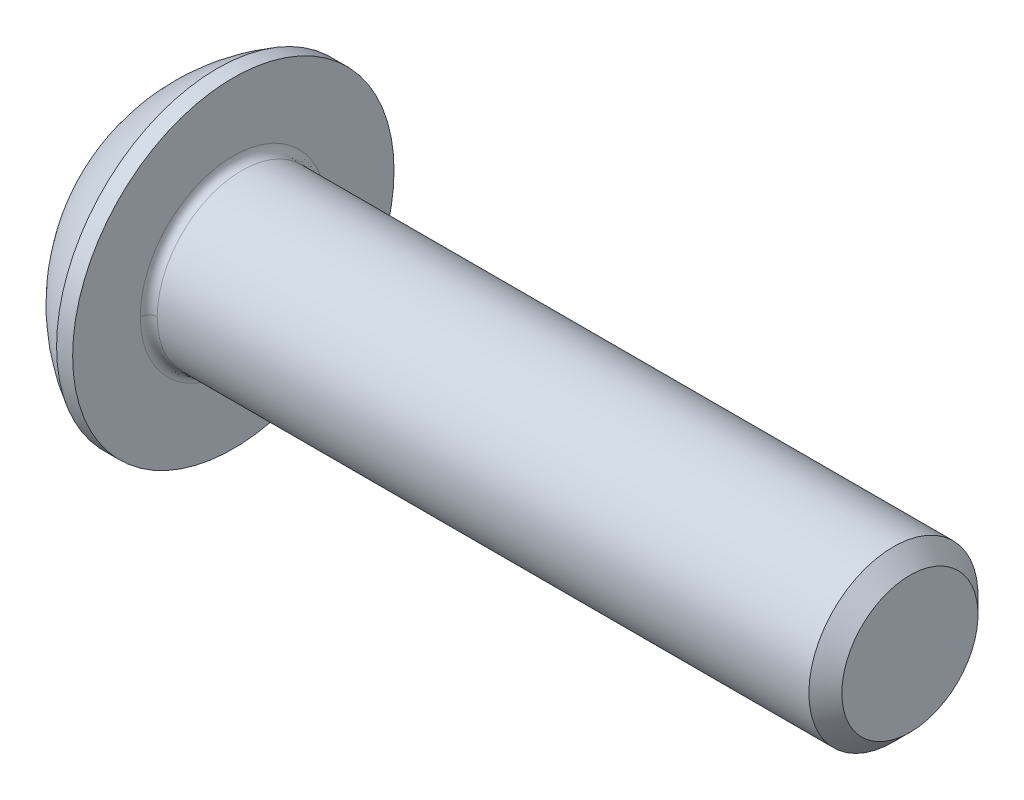
ISO-10303-21;
HEADER;
FILE_DESCRIPTION(('STEP AP214'),'2;1');
FILE_NAME('part.step','',(''),(''),'','','');
FILE_SCHEMA(('AUTOMOTIVE_DESIGN { 1 0 10303 214 1 1 1 1 }'));
ENDSEC;
DATA;
#1=APPLICATION_CONTEXT('core data for automotive mechanical design processes');
#2=APPLICATION_PROTOCOL_DEFINITION('international standard','automotive_design',2000,#1);
#3=PRODUCT_CONTEXT('',#1,'mechanical');
#4=PRODUCT('Part','Part','',(#3));
#5=PRODUCT_RELATED_PRODUCT_CATEGORY('part','',(#4));
#6=PRODUCT_DEFINITION_FORMATION('','',#4);
#7=PRODUCT_DEFINITION_CONTEXT('part definition',#1,'design');
#8=PRODUCT_DEFINITION('design','',#6,#7);
#9=PRODUCT_DEFINITION_SHAPE('','',#8);
#10=(LENGTH_UNIT() NAMED_UNIT(*) SI_UNIT(.MILLI.,.METRE.));
#11=(NAMED_UNIT(*) PLANE_ANGLE_UNIT() SI_UNIT($,.RADIAN.));
#12=(NAMED_UNIT(*) SI_UNIT($,.STERADIAN.) SOLID_ANGLE_UNIT());
#13=UNCERTAINTY_MEASURE_WITH_UNIT(LENGTH_MEASURE(1.E-05),#10,'distance_accuracy_value','');
#14=(GEOMETRIC_REPRESENTATION_CONTEXT(3) GLOBAL_UNCERTAINTY_ASSIGNED_CONTEXT((#13)) GLOBAL_UNIT_ASSIGNED_CONTEXT((#10,
#11,#12)) REPRESENTATION_CONTEXT('',''));
#15=CARTESIAN_POINT('',(0.,0.,0.));
#16=DIRECTION('',(0.,0.,1.));
#17=DIRECTION('',(1.,0.,0.));
#18=AXIS2_PLACEMENT_3D('',#15,#16,#17);
#19=CARTESIAN_POINT('',(18.2,-1.62932,-1.62932));
#20=DIRECTION('',(-1.,0.,0.));
#21=DIRECTION('',(0.,0.,1.));
#22=AXIS2_PLACEMENT_3D('',#19,#20,#21);
#23=PLANE('',#22);
#24=CARTESIAN_POINT('',(18.2,0.,0.));
#25=DIRECTION('',(-1.,0.,0.));
#26=DIRECTION('',(0.,0.,1.));
#27=AXIS2_PLACEMENT_3D('',#24,#25,#26);
#28=CIRCLE('',#27,1.61000000000001);
#29=CARTESIAN_POINT('',(18.2,0.,1.61000000000001));
#30=VERTEX_POINT('',#29);
#31=EDGE_CURVE('E20',#30,#30,#28,.F.);
#32=ORIENTED_EDGE('',*,*,#31,.T.);
#33=EDGE_LOOP('',(#32));
#34=FACE_BOUND('',#33,.T.);
#35=ADVANCED_FACE('F16',(#34),#23,.F.);
#36=CARTESIAN_POINT('',(18.2,0.,0.));
#37=DIRECTION('',(-1.,0.,0.));
#38=DIRECTION('',(0.,0.,1.));
#39=AXIS2_PLACEMENT_3D('',#36,#37,#38);
#40=CONICAL_SURFACE('',#39,1.61,0.785398163397451);
#41=CARTESIAN_POINT('',(17.81,0.,0.));
#42=DIRECTION('',(-1.,0.,0.));
#43=DIRECTION('',(0.,0.,1.));
#44=AXIS2_PLACEMENT_3D('',#41,#42,#43);
#45=CIRCLE('',#44,2.);
#46=CARTESIAN_POINT('',(17.81,0.,2.));
#47=VERTEX_POINT('',#46);
#48=EDGE_CURVE('E116',#47,#47,#45,.F.);
#49=ORIENTED_EDGE('',*,*,#48,.T.);
#50=EDGE_LOOP('',(#49));
#51=FACE_BOUND('',#50,.T.);
#52=ORIENTED_EDGE('',*,*,#31,.F.);
#53=EDGE_LOOP('',(#52));
#54=FACE_BOUND('',#53,.T.);
#55=ADVANCED_FACE('F250',(#51,#54),#40,.T.);
#56=CARTESIAN_POINT('',(17.81,0.,0.));
#57=DIRECTION('',(-1.,0.,0.));
#58=DIRECTION('',(0.,0.,1.));
#59=AXIS2_PLACEMENT_3D('',#56,#57,#58);
#60=CYLINDRICAL_SURFACE('',#59,2.);
#61=CARTESIAN_POINT('',(2.39999999962598,0.,0.));
#62=DIRECTION('',(1.,0.,0.));
#63=DIRECTION('',(0.,0.,-1.));
#64=AXIS2_PLACEMENT_3D('',#61,#62,#63);
#65=CIRCLE('',#64,1.99999999998839);
#66=CARTESIAN_POINT('',(2.39999999971949,-2.05103428515331E-10,-1.9999999999913));
#67=VERTEX_POINT('',#66);
#68=CARTESIAN_POINT('',(2.39999999971949,0.,1.9999999999913));
#69=VERTEX_POINT('',#68);
#70=EDGE_CURVE('E115',#67,#69,#65,.T.);
#71=ORIENTED_EDGE('',*,*,#70,.T.);
#72=CARTESIAN_POINT('',(2.39999999962598,0.,0.));
#73=DIRECTION('',(1.,0.,0.));
#74=DIRECTION('',(0.,0.,-1.));
#75=AXIS2_PLACEMENT_3D('',#72,#73,#74);
#76=CIRCLE('',#75,1.99999999998839);
#77=EDGE_CURVE('E106',#69,#67,#76,.T.);
#78=ORIENTED_EDGE('',*,*,#77,.T.);
#79=EDGE_LOOP('',(#71,#78));
#80=FACE_BOUND('',#79,.T.);
#81=ORIENTED_EDGE('',*,*,#48,.F.);
#82=EDGE_LOOP('',(#81));
#83=FACE_BOUND('',#82,.T.);
#84=ADVANCED_FACE('F124',(#80,#83),#60,.T.);
#85=CARTESIAN_POINT('',(2.419966683,0.,-2.000999167));
#86=CARTESIAN_POINT('',(2.419966683,-4.001998334,-2.000999167));
#87=CARTESIAN_POINT('',(2.419966683,-4.001998334,2.000999167));
#88=CARTESIAN_POINT('',(2.419966683,0.,2.000999167));
#89=CARTESIAN_POINT('',(2.283989247,0.,-1.987355915));
#90=CARTESIAN_POINT('',(2.283989247,-3.974711831,-1.987355915));
#91=CARTESIAN_POINT('',(2.283989247,-3.974711831,1.987355915));
#92=CARTESIAN_POINT('',(2.283989247,0.,1.987355915));
#93=CARTESIAN_POINT('',(2.187355915,0.,-2.083989247));
#94=CARTESIAN_POINT('',(2.187355915,-4.167978494,-2.083989247));
#95=CARTESIAN_POINT('',(2.187355915,-4.167978494,2.083989247));
#96=CARTESIAN_POINT('',(2.187355915,0.,2.083989247));
#97=CARTESIAN_POINT('',(2.200999167,0.,-2.219966683));
#98=CARTESIAN_POINT('',(2.200999167,-4.439933367,-2.219966683));
#99=CARTESIAN_POINT('',(2.200999167,-4.439933367,2.219966683));
#100=CARTESIAN_POINT('',(2.200999167,0.,2.219966683));
#101=(BOUNDED_SURFACE() B_SPLINE_SURFACE(3,3,((#85,#86,#87,#88),(#89,#90,#91,#92),(#93,#94,#95,
#96),(#97,#98,#99,#100)),.UNSPECIFIED.,.F.,.F.,.F.) B_SPLINE_SURFACE_WITH_KNOTS((4,4),(4,4),(0.,
1.),(0.,1.),.UNSPECIFIED.) GEOMETRIC_REPRESENTATION_ITEM() RATIONAL_B_SPLINE_SURFACE(((1.,
0.333333333333333,0.333333333333333,1.),(0.755320871117973,0.251773623705991,0.251773623705991,
0.755320871117973),(0.755320871117973,0.251773623705991,0.251773623705991,0.755320871117973),
(1.,0.333333333333333,0.333333333333333,1.))) REPRESENTATION_ITEM('') SURFACE());
#102=CARTESIAN_POINT('',(2.419966683,0.,-2.000999167));
#103=CARTESIAN_POINT('',(2.283989247,0.,-1.987355915));
#104=CARTESIAN_POINT('',(2.187355915,0.,-2.083989247));
#105=CARTESIAN_POINT('',(2.200999167,0.,-2.219966683));
#106=(BOUNDED_CURVE() B_SPLINE_CURVE(3,(#102,#103,#104,#105),.UNSPECIFIED.,.F.,
.F.) B_SPLINE_CURVE_WITH_KNOTS((4,4),(0.,1.),
.UNSPECIFIED.) CURVE() GEOMETRIC_REPRESENTATION_ITEM() RATIONAL_B_SPLINE_CURVE((1.,
0.755320871117973,0.755320871117973,1.)) REPRESENTATION_ITEM(''));
#107=CARTESIAN_POINT('',(2.19999999999304,0.,-2.19999999989933));
#108=VERTEX_POINT('',#107);
#109=EDGE_CURVE('E112',#108,#67,#106,.F.);
#110=CARTESIAN_POINT('',(2.419966683,0.,2.000999167));
#111=CARTESIAN_POINT('',(2.283989247,0.,1.987355915));
#112=CARTESIAN_POINT('',(2.187355915,0.,2.083989247));
#113=CARTESIAN_POINT('',(2.200999167,0.,2.219966683));
#114=(BOUNDED_CURVE() B_SPLINE_CURVE(3,(#110,#111,#112,#113),.UNSPECIFIED.,.F.,
.F.) B_SPLINE_CURVE_WITH_KNOTS((4,4),(0.,1.),
.UNSPECIFIED.) CURVE() GEOMETRIC_REPRESENTATION_ITEM() RATIONAL_B_SPLINE_CURVE((1.,
0.755320871117973,0.755320871117973,1.)) REPRESENTATION_ITEM(''));
#115=CARTESIAN_POINT('',(2.19999999999304,0.,2.19999999989934));
#116=VERTEX_POINT('',#115);
#117=EDGE_CURVE('E110',#69,#116,#114,.T.);
#118=CARTESIAN_POINT('',(2.19999999998839,0.,2.19999999940735));
#119=CARTESIAN_POINT('',(2.19999999998839,-4.39999999968315,2.19999999940735));
#120=CARTESIAN_POINT('',(2.19999999998839,-4.39999999968315,-2.19999999940735));
#121=CARTESIAN_POINT('',(2.19999999998839,0.,-2.19999999940735));
#122=(BOUNDED_CURVE() B_SPLINE_CURVE(3,(#118,#119,#120,#121),.UNSPECIFIED.,.F.,
.F.) B_SPLINE_CURVE_WITH_KNOTS((4,4),(0.,1.),
.UNSPECIFIED.) CURVE() GEOMETRIC_REPRESENTATION_ITEM() RATIONAL_B_SPLINE_CURVE((0.956578301732849,
0.31885943391095,0.31885943391095,0.956578301732849)) REPRESENTATION_ITEM(''));
#123=EDGE_CURVE('E136',#116,#108,#122,.T.);
#124=ORIENTED_EDGE('',*,*,#109,.T.);
#125=ORIENTED_EDGE('',*,*,#77,.F.);
#126=ORIENTED_EDGE('',*,*,#117,.T.);
#127=ORIENTED_EDGE('',*,*,#123,.T.);
#128=EDGE_LOOP('',(#124,#125,#126,#127));
#129=FACE_BOUND('',#128,.T.);
#130=ADVANCED_FACE('F108',(#129),#101,.F.);
#131=CARTESIAN_POINT('',(2.419966683,0.,2.000999167));
#132=CARTESIAN_POINT('',(2.419966683,4.001998334,2.000999167));
#133=CARTESIAN_POINT('',(2.419966683,4.001998334,-2.000999167));
#134=CARTESIAN_POINT('',(2.419966683,0.,-2.000999167));
#135=CARTESIAN_POINT('',(2.283989247,0.,1.987355915));
#136=CARTESIAN_POINT('',(2.283989247,3.974711831,1.987355915));
#137=CARTESIAN_POINT('',(2.283989247,3.974711831,-1.987355915));
#138=CARTESIAN_POINT('',(2.283989247,0.,-1.987355915));
#139=CARTESIAN_POINT('',(2.187355915,0.,2.083989247));
#140=CARTESIAN_POINT('',(2.187355915,4.167978494,2.083989247));
#141=CARTESIAN_POINT('',(2.187355915,4.167978494,-2.083989247));
#142=CARTESIAN_POINT('',(2.187355915,0.,-2.083989247));
#143=CARTESIAN_POINT('',(2.200999167,0.,2.219966683));
#144=CARTESIAN_POINT('',(2.200999167,4.439933367,2.219966683));
#145=CARTESIAN_POINT('',(2.200999167,4.439933367,-2.219966683));
#146=CARTESIAN_POINT('',(2.200999167,0.,-2.219966683));
#147=(BOUNDED_SURFACE() B_SPLINE_SURFACE(3,3,((#131,#132,#133,#134),(#135,#136,#137,#138),(#139,
#140,#141,#142),(#143,#144,#145,#146)),.UNSPECIFIED.,.F.,.F.,
.F.) B_SPLINE_SURFACE_WITH_KNOTS((4,4),(4,4),(0.,1.),(0.,1.),
.UNSPECIFIED.) GEOMETRIC_REPRESENTATION_ITEM() RATIONAL_B_SPLINE_SURFACE(((1.,0.333333333333333,
0.333333333333333,1.),(0.755320871117973,0.251773623705991,0.251773623705991,0.755320871117973),
(0.755320871117973,0.251773623705991,0.251773623705991,0.755320871117973),(1.,0.333333333333333,
0.333333333333333,1.))) REPRESENTATION_ITEM('') SURFACE());
#148=CARTESIAN_POINT('',(2.19999999998839,0.,-2.19999999940735));
#149=CARTESIAN_POINT('',(2.19999999998839,4.39999999968315,-2.19999999940735));
#150=CARTESIAN_POINT('',(2.19999999998839,4.39999999968315,2.19999999940735));
#151=CARTESIAN_POINT('',(2.19999999998839,0.,2.19999999940735));
#152=(BOUNDED_CURVE() B_SPLINE_CURVE(3,(#148,#149,#150,#151),.UNSPECIFIED.,.F.,
.F.) B_SPLINE_CURVE_WITH_KNOTS((4,4),(0.,1.),
.UNSPECIFIED.) CURVE() GEOMETRIC_REPRESENTATION_ITEM() RATIONAL_B_SPLINE_CURVE((0.956578301732849,
0.31885943391095,0.31885943391095,0.956578301732849)) REPRESENTATION_ITEM(''));
#153=EDGE_CURVE('E121',#108,#116,#152,.T.);
#154=ORIENTED_EDGE('',*,*,#153,.T.);
#155=ORIENTED_EDGE('',*,*,#117,.F.);
#156=ORIENTED_EDGE('',*,*,#70,.F.);
#157=ORIENTED_EDGE('',*,*,#109,.F.);
#158=EDGE_LOOP('',(#154,#155,#156,#157));
#159=FACE_BOUND('',#158,.T.);
#160=ADVANCED_FACE('F119',(#159),#147,.F.);
#161=CARTESIAN_POINT('',(2.2,-3.8456,-3.8456));
#162=DIRECTION('',(-1.,0.,0.));
#163=DIRECTION('',(0.,0.,1.));
#164=AXIS2_PLACEMENT_3D('',#161,#162,#163);
#165=PLANE('',#164);
#166=ORIENTED_EDGE('',*,*,#123,.F.);
#167=ORIENTED_EDGE('',*,*,#153,.F.);
#168=EDGE_LOOP('',(#166,#167));
#169=FACE_BOUND('',#168,.T.);
#170=CARTESIAN_POINT('',(2.2,0.,0.));
#171=DIRECTION('',(-1.,0.,0.));
#172=DIRECTION('',(0.,0.,1.));
#173=AXIS2_PLACEMENT_3D('',#170,#171,#172);
#174=CIRCLE('',#173,3.8);
#175=CARTESIAN_POINT('',(2.2,0.,3.8));
#176=VERTEX_POINT('',#175);
#177=EDGE_CURVE('E206',#176,#176,#174,.F.);
#178=ORIENTED_EDGE('',*,*,#177,.T.);
#179=EDGE_LOOP('',(#178));
#180=FACE_BOUND('',#179,.T.);
#181=ADVANCED_FACE('F142',(#169,#180),#165,.F.);
#182=CARTESIAN_POINT('',(2.2,0.,0.));
#183=DIRECTION('',(-1.,0.,0.));
#184=DIRECTION('',(0.,0.,1.));
#185=AXIS2_PLACEMENT_3D('',#182,#183,#184);
#186=CYLINDRICAL_SURFACE('',#185,3.8);
#187=ORIENTED_EDGE('',*,*,#177,.F.);
#188=EDGE_LOOP('',(#187));
#189=FACE_BOUND('',#188,.T.);
#190=CARTESIAN_POINT('',(1.82000003702026,0.,0.));
#191=DIRECTION('',(-1.,0.,0.));
#192=DIRECTION('',(0.,1.,0.));
#193=AXIS2_PLACEMENT_3D('',#190,#191,#192);
#194=CIRCLE('',#193,3.80000002105012);
#195=CARTESIAN_POINT('',(1.82000003702026,3.80000002105012,0.));
#196=VERTEX_POINT('',#195);
#197=EDGE_CURVE('E205',#196,#196,#194,.F.);
#198=ORIENTED_EDGE('',*,*,#197,.T.);
#199=EDGE_LOOP('',(#198));
#200=FACE_BOUND('',#199,.T.);
#201=ADVANCED_FACE('F152',(#189,#200),#186,.T.);
#202=CARTESIAN_POINT('',(3.885274725,0.,0.));
#203=DIRECTION('',(-1.,0.,0.));
#204=DIRECTION('',(0.,-1.,0.));
#205=AXIS2_PLACEMENT_3D('',#202,#203,#204);
#206=SPHERICAL_SURFACE('',#205,4.324969329);
#207=ORIENTED_EDGE('',*,*,#197,.F.);
#208=EDGE_LOOP('',(#207));
#209=FACE_BOUND('',#208,.T.);
#210=CARTESIAN_POINT('',(0.,0.,0.));
#211=DIRECTION('',(-1.,0.,0.));
#212=DIRECTION('',(0.,0.,1.));
#213=AXIS2_PLACEMENT_3D('',#210,#211,#212);
#214=CIRCLE('',#213,1.90000000212286);
#215=CARTESIAN_POINT('',(0.,0.,1.90000000212286));
#216=VERTEX_POINT('',#215);
#217=EDGE_CURVE('E203',#216,#216,#214,.T.);
#218=ORIENTED_EDGE('',*,*,#217,.F.);
#219=EDGE_LOOP('',(#218));
#220=FACE_BOUND('',#219,.T.);
#221=ADVANCED_FACE('F271',(#209,#220),#206,.T.);
#222=CARTESIAN_POINT('',(0.,1.443375673,0.));
#223=DIRECTION('',(0.,-0.866025403630548,0.500000000266546));
#224=DIRECTION('',(0.,-0.500000000266546,-0.866025403630548));
#225=AXIS2_PLACEMENT_3D('',#222,#223,#224);
#226=PLANE('',#225);
#227=DIRECTION('',(0.,0.500000000957796,0.866025403231455));
#228=VECTOR('',#227,1.);
#229=CARTESIAN_POINT('',(0.,0.721687835061601,-1.2500000009992));
#230=LINE('',#229,#228);
#231=CARTESIAN_POINT('',(0.,0.721687835819245,-1.25));
#232=VERTEX_POINT('',#231);
#233=CARTESIAN_POINT('',(0.,1.4433756732422,-4.19502377713848E-10));
#234=VERTEX_POINT('',#233);
#235=EDGE_CURVE('E199',#232,#234,#230,.T.);
#236=ORIENTED_EDGE('',*,*,#235,.F.);
#237=DIRECTION('',(-1.,0.,0.));
#238=VECTOR('',#237,1.);
#239=CARTESIAN_POINT('',(0.65,0.721687836,-1.25));
#240=LINE('',#239,#238);
#241=CARTESIAN_POINT('',(1.3,0.721687836033648,-1.25));
#242=VERTEX_POINT('',#241);
#243=EDGE_CURVE('E79',#242,#232,#240,.T.);
#244=ORIENTED_EDGE('',*,*,#243,.F.);
#245=DIRECTION('',(0.,-0.499999999995552,-0.866025403787006));
#246=VECTOR('',#245,1.);
#247=CARTESIAN_POINT('',(1.3,1.08253175420189,-0.62500000018125));
#248=LINE('',#247,#246);
#249=CARTESIAN_POINT('',(1.3,1.08253175469602,-0.624999999692595));
#250=VERTEX_POINT('',#249);
#251=EDGE_CURVE('E188',#250,#242,#248,.T.);
#252=ORIENTED_EDGE('',*,*,#251,.F.);
#253=DIRECTION('',(0.,-0.4999999997305,-0.866025403940035));
#254=VECTOR('',#253,1.);
#255=CARTESIAN_POINT('',(1.3,1.44337567240261,0.));
#256=LINE('',#255,#254);
#257=CARTESIAN_POINT('',(1.3,1.44337567258929,-6.4669870913041E-11));
#258=VERTEX_POINT('',#257);
#259=EDGE_CURVE('E191',#258,#250,#256,.T.);
#260=ORIENTED_EDGE('',*,*,#259,.F.);
#261=DIRECTION('',(1.,0.,0.));
#262=VECTOR('',#261,1.);
#263=CARTESIAN_POINT('',(0.65,1.443375673,0.));
#264=LINE('',#263,#262);
#265=EDGE_CURVE('E198',#234,#258,#264,.T.);
#266=ORIENTED_EDGE('',*,*,#265,.F.);
#267=EDGE_LOOP('',(#236,#244,#252,#260,#266));
#268=FACE_BOUND('',#267,.T.);
#269=ADVANCED_FACE('F154',(#268),#226,.T.);
#270=CARTESIAN_POINT('',(0.,-1.9228,-1.9228));
#271=DIRECTION('',(-1.,0.,0.));
#272=DIRECTION('',(0.,0.,1.));
#273=AXIS2_PLACEMENT_3D('',#270,#271,#272);
#274=PLANE('',#273);
#275=ORIENTED_EDGE('',*,*,#235,.T.);
#276=DIRECTION('',(0.,0.500000000266546,-0.866025403630548));
#277=VECTOR('',#276,1.);
#278=CARTESIAN_POINT('',(0.,1.0825317545,0.625));
#279=LINE('',#278,#277);
#280=CARTESIAN_POINT('',(0.,0.721687835732389,1.25000000019262));
#281=VERTEX_POINT('',#280);
#282=EDGE_CURVE('E202',#281,#234,#279,.T.);
#283=ORIENTED_EDGE('',*,*,#282,.F.);
#284=DIRECTION('',(0.,1.,0.));
#285=VECTOR('',#284,1.);
#286=CARTESIAN_POINT('',(0.,0.,1.25));
#287=LINE('',#286,#285);
#288=CARTESIAN_POINT('',(0.,-0.721687836,1.25));
#289=VERTEX_POINT('',#288);
#290=EDGE_CURVE('E304',#289,#281,#287,.T.);
#291=ORIENTED_EDGE('',*,*,#290,.F.);
#292=DIRECTION('',(0.,0.500000000266546,0.866025403630548));
#293=VECTOR('',#292,1.);
#294=CARTESIAN_POINT('',(0.,-1.0825317545,0.625));
#295=LINE('',#294,#293);
#296=CARTESIAN_POINT('',(0.,-1.443375673,0.));
#297=VERTEX_POINT('',#296);
#298=EDGE_CURVE('E311',#297,#289,#295,.T.);
#299=ORIENTED_EDGE('',*,*,#298,.F.);
#300=DIRECTION('',(0.,-0.500000000266546,0.866025403630548));
#301=VECTOR('',#300,1.);
#302=CARTESIAN_POINT('',(0.,-1.0825317545,-0.625));
#303=LINE('',#302,#301);
#304=CARTESIAN_POINT('',(0.,-0.721687836,-1.25));
#305=VERTEX_POINT('',#304);
#306=EDGE_CURVE('E297',#305,#297,#303,.T.);
#307=ORIENTED_EDGE('',*,*,#306,.F.);
#308=DIRECTION('',(0.,-1.,0.));
#309=VECTOR('',#308,1.);
#310=CARTESIAN_POINT('',(0.,0.,-1.25));
#311=LINE('',#310,#309);
#312=EDGE_CURVE('E84',#232,#305,#311,.T.);
#313=ORIENTED_EDGE('',*,*,#312,.F.);
#314=EDGE_LOOP('',(#275,#283,#291,#299,#307,#313));
#315=FACE_BOUND('',#314,.T.);
#316=ORIENTED_EDGE('',*,*,#217,.T.);
#317=EDGE_LOOP('',(#316));
#318=FACE_BOUND('',#317,.T.);
#319=ADVANCED_FACE('F349',(#315,#318),#274,.T.);
#320=CARTESIAN_POINT('',(0.,0.721687836,1.25));
#321=DIRECTION('',(0.,-0.866025403630548,-0.500000000266546));
#322=DIRECTION('',(0.,0.500000000266546,-0.866025403630548));
#323=AXIS2_PLACEMENT_3D('',#320,#321,#322);
#324=PLANE('',#323);
#325=ORIENTED_EDGE('',*,*,#282,.T.);
#326=ORIENTED_EDGE('',*,*,#265,.T.);
#327=DIRECTION('',(0.,0.4999999997305,-0.866025403940035));
#328=VECTOR('',#327,1.);
#329=CARTESIAN_POINT('',(1.3,1.08253175459739,0.62499999969));
#330=LINE('',#329,#328);
#331=CARTESIAN_POINT('',(1.3,1.08253175444642,0.624999999854609));
#332=VERTEX_POINT('',#331);
#333=EDGE_CURVE('E193',#332,#258,#330,.T.);
#334=ORIENTED_EDGE('',*,*,#333,.F.);
#335=DIRECTION('',(0.,0.499999999995552,-0.866025403787006));
#336=VECTOR('',#335,1.);
#337=CARTESIAN_POINT('',(1.3,0.721687836067296,1.25));
#338=LINE('',#337,#336);
#339=CARTESIAN_POINT('',(1.3,0.721687836033648,1.25));
#340=VERTEX_POINT('',#339);
#341=EDGE_CURVE('E196',#340,#332,#338,.T.);
#342=ORIENTED_EDGE('',*,*,#341,.F.);
#343=DIRECTION('',(1.,0.,0.));
#344=VECTOR('',#343,1.);
#345=CARTESIAN_POINT('',(0.65,0.721687836,1.25));
#346=LINE('',#345,#344);
#347=EDGE_CURVE('E187',#281,#340,#346,.T.);
#348=ORIENTED_EDGE('',*,*,#347,.F.);
#349=EDGE_LOOP('',(#325,#326,#334,#342,#348));
#350=FACE_BOUND('',#349,.T.);
#351=ADVANCED_FACE('F355',(#350),#324,.T.);
#352=CARTESIAN_POINT('',(1.3,-0.006495191,0.62125));
#353=DIRECTION('',(-1.,0.,0.));
#354=DIRECTION('',(0.,0.,1.));
#355=AXIS2_PLACEMENT_3D('',#352,#353,#354);
#356=PLANE('',#355);
#357=ORIENTED_EDGE('',*,*,#341,.T.);
#358=CARTESIAN_POINT('',(1.3,0.,0.));
#359=DIRECTION('',(-1.,0.,0.));
#360=DIRECTION('',(0.,0.,1.));
#361=AXIS2_PLACEMENT_3D('',#358,#359,#360);
#362=CIRCLE('',#361,1.25);
#363=CARTESIAN_POINT('',(1.3,-1.12242035535916E-10,1.25));
#364=VERTEX_POINT('',#363);
#365=EDGE_CURVE('E184',#364,#332,#362,.T.);
#366=ORIENTED_EDGE('',*,*,#365,.F.);
#367=DIRECTION('',(0.,-1.,0.));
#368=VECTOR('',#367,1.);
#369=CARTESIAN_POINT('',(1.3,0.,1.25));
#370=LINE('',#369,#368);
#371=EDGE_CURVE('E314',#340,#364,#370,.T.);
#372=ORIENTED_EDGE('',*,*,#371,.F.);
#373=EDGE_LOOP('',(#357,#366,#372));
#374=FACE_BOUND('',#373,.T.);
#375=ADVANCED_FACE('F338',(#374),#356,.T.);
#376=CARTESIAN_POINT('',(1.3,1.080366691,-0.6325));
#377=DIRECTION('',(-1.,0.,0.));
#378=DIRECTION('',(0.,0.,1.));
#379=AXIS2_PLACEMENT_3D('',#376,#377,#378);
#380=PLANE('',#379);
#381=ORIENTED_EDGE('',*,*,#259,.T.);
#382=CARTESIAN_POINT('',(1.3,0.,0.));
#383=DIRECTION('',(-1.,0.,0.));
#384=DIRECTION('',(0.,0.,1.));
#385=AXIS2_PLACEMENT_3D('',#382,#383,#384);
#386=CIRCLE('',#385,1.25);
#387=EDGE_CURVE('E181',#332,#250,#386,.T.);
#388=ORIENTED_EDGE('',*,*,#387,.F.);
#389=ORIENTED_EDGE('',*,*,#333,.T.);
#390=EDGE_LOOP('',(#381,#388,#389));
#391=FACE_BOUND('',#390,.T.);
#392=ADVANCED_FACE('F359',(#391),#380,.T.);
#393=CARTESIAN_POINT('',(1.3,-0.006495191,-1.25));
#394=DIRECTION('',(-1.,0.,0.));
#395=DIRECTION('',(0.,0.,1.));
#396=AXIS2_PLACEMENT_3D('',#393,#394,#395);
#397=PLANE('',#396);
#398=DIRECTION('',(0.,1.,0.));
#399=VECTOR('',#398,1.);
#400=CARTESIAN_POINT('',(1.3,0.,-1.25));
#401=LINE('',#400,#399);
#402=CARTESIAN_POINT('',(1.3,-2.56379285644164E-10,-1.25));
#403=VERTEX_POINT('',#402);
#404=EDGE_CURVE('E190',#403,#242,#401,.T.);
#405=ORIENTED_EDGE('',*,*,#404,.F.);
#406=CARTESIAN_POINT('',(1.3,0.,0.));
#407=DIRECTION('',(-1.,0.,0.));
#408=DIRECTION('',(0.,0.,1.));
#409=AXIS2_PLACEMENT_3D('',#406,#407,#408);
#410=CIRCLE('',#409,1.25);
#411=EDGE_CURVE('E179',#250,#403,#410,.T.);
#412=ORIENTED_EDGE('',*,*,#411,.F.);
#413=ORIENTED_EDGE('',*,*,#251,.T.);
#414=EDGE_LOOP('',(#405,#412,#413));
#415=FACE_BOUND('',#414,.T.);
#416=ADVANCED_FACE('F365',(#415),#397,.T.);
#417=CARTESIAN_POINT('',(0.,0.721687836,-1.25));
#418=DIRECTION('',(0.,0.,1.));
#419=DIRECTION('',(0.,-1.,0.));
#420=AXIS2_PLACEMENT_3D('',#417,#418,#419);
#421=PLANE('',#420);
#422=ORIENTED_EDGE('',*,*,#312,.T.);
#423=DIRECTION('',(-1.,0.,0.));
#424=VECTOR('',#423,1.);
#425=CARTESIAN_POINT('',(0.65,-0.721687836,-1.25));
#426=LINE('',#425,#424);
#427=CARTESIAN_POINT('',(1.3,-0.721687836033648,-1.25));
#428=VERTEX_POINT('',#427);
#429=EDGE_CURVE('E294',#428,#305,#426,.T.);
#430=ORIENTED_EDGE('',*,*,#429,.F.);
#431=DIRECTION('',(0.,-1.,0.));
#432=VECTOR('',#431,1.);
#433=CARTESIAN_POINT('',(1.3,-0.541265877,-1.25));
#434=LINE('',#433,#432);
#435=EDGE_CURVE('E178',#403,#428,#434,.T.);
#436=ORIENTED_EDGE('',*,*,#435,.F.);
#437=ORIENTED_EDGE('',*,*,#404,.T.);
#438=ORIENTED_EDGE('',*,*,#243,.T.);
#439=EDGE_LOOP('',(#422,#430,#436,#437,#438));
#440=FACE_BOUND('',#439,.T.);
#441=ADVANCED_FACE('F367',(#440),#421,.T.);
#442=CARTESIAN_POINT('',(0.,-0.721687836,-1.25));
#443=DIRECTION('',(0.,0.866025403630548,0.500000000266546));
#444=DIRECTION('',(0.,-0.500000000266546,0.866025403630548));
#445=AXIS2_PLACEMENT_3D('',#442,#443,#444);
#446=PLANE('',#445);
#447=ORIENTED_EDGE('',*,*,#306,.T.);
#448=DIRECTION('',(-1.,0.,0.));
#449=VECTOR('',#448,1.);
#450=CARTESIAN_POINT('',(0.65,-1.443375673,0.));
#451=LINE('',#450,#449);
#452=CARTESIAN_POINT('',(1.3,-1.44337567258929,6.46697489402966E-11));
#453=VERTEX_POINT('',#452);
#454=EDGE_CURVE('E299',#453,#297,#451,.T.);
#455=ORIENTED_EDGE('',*,*,#454,.F.);
#456=DIRECTION('',(0.,-0.4999999997305,0.866025403940035));
#457=VECTOR('',#456,1.);
#458=CARTESIAN_POINT('',(1.3,-1.08253175459739,-0.62499999969));
#459=LINE('',#458,#457);
#460=CARTESIAN_POINT('',(1.3,-1.08253175444642,-0.624999999854609));
#461=VERTEX_POINT('',#460);
#462=EDGE_CURVE('E174',#461,#453,#459,.T.);
#463=ORIENTED_EDGE('',*,*,#462,.F.);
#464=DIRECTION('',(0.,-0.499999999995553,0.866025403787006));
#465=VECTOR('',#464,1.);
#466=CARTESIAN_POINT('',(1.3,-0.721687836067296,-1.25));
#467=LINE('',#466,#465);
#468=EDGE_CURVE('E176',#428,#461,#467,.T.);
#469=ORIENTED_EDGE('',*,*,#468,.F.);
#470=ORIENTED_EDGE('',*,*,#429,.T.);
#471=EDGE_LOOP('',(#447,#455,#463,#469,#470));
#472=FACE_BOUND('',#471,.T.);
#473=ADVANCED_FACE('F372',(#472),#446,.T.);
#474=CARTESIAN_POINT('',(0.,-1.443375673,0.));
#475=DIRECTION('',(0.,0.866025403630548,-0.500000000266546));
#476=DIRECTION('',(0.,0.500000000266546,0.866025403630548));
#477=AXIS2_PLACEMENT_3D('',#474,#475,#476);
#478=PLANE('',#477);
#479=ORIENTED_EDGE('',*,*,#298,.T.);
#480=DIRECTION('',(-1.,0.,0.));
#481=VECTOR('',#480,1.);
#482=CARTESIAN_POINT('',(0.65,-0.721687836,1.25));
#483=LINE('',#482,#481);
#484=CARTESIAN_POINT('',(1.3,-0.721687836033648,1.25));
#485=VERTEX_POINT('',#484);
#486=EDGE_CURVE('E308',#485,#289,#483,.T.);
#487=ORIENTED_EDGE('',*,*,#486,.F.);
#488=DIRECTION('',(0.,0.499999999995553,0.866025403787006));
#489=VECTOR('',#488,1.);
#490=CARTESIAN_POINT('',(1.3,-1.08253175420189,0.62500000018125));
#491=LINE('',#490,#489);
#492=CARTESIAN_POINT('',(1.3,-1.08253175470543,0.624999999773191));
#493=VERTEX_POINT('',#492);
#494=EDGE_CURVE('E170',#493,#485,#491,.T.);
#495=ORIENTED_EDGE('',*,*,#494,.F.);
#496=DIRECTION('',(0.,0.4999999997305,0.866025403940035));
#497=VECTOR('',#496,1.);
#498=CARTESIAN_POINT('',(1.3,-1.44337567240261,0.));
#499=LINE('',#498,#497);
#500=EDGE_CURVE('E35',#453,#493,#499,.T.);
#501=ORIENTED_EDGE('',*,*,#500,.F.);
#502=ORIENTED_EDGE('',*,*,#454,.T.);
#503=EDGE_LOOP('',(#479,#487,#495,#501,#502));
#504=FACE_BOUND('',#503,.T.);
#505=ADVANCED_FACE('F343',(#504),#478,.T.);
#506=CARTESIAN_POINT('',(0.,-0.721687836,1.25));
#507=DIRECTION('',(0.,0.,-1.));
#508=DIRECTION('',(0.,1.,0.));
#509=AXIS2_PLACEMENT_3D('',#506,#507,#508);
#510=PLANE('',#509);
#511=ORIENTED_EDGE('',*,*,#290,.T.);
#512=ORIENTED_EDGE('',*,*,#347,.T.);
#513=ORIENTED_EDGE('',*,*,#371,.T.);
#514=DIRECTION('',(0.,1.,0.));
#515=VECTOR('',#514,1.);
#516=CARTESIAN_POINT('',(1.3,-0.541265877,1.25));
#517=LINE('',#516,#515);
#518=EDGE_CURVE('E169',#485,#364,#517,.T.);
#519=ORIENTED_EDGE('',*,*,#518,.F.);
#520=ORIENTED_EDGE('',*,*,#486,.T.);
#521=EDGE_LOOP('',(#511,#512,#513,#519,#520));
#522=FACE_BOUND('',#521,.T.);
#523=ADVANCED_FACE('F346',(#522),#510,.T.);
#524=CARTESIAN_POINT('',(1.3,-1.089026945,-1.25));
#525=DIRECTION('',(-1.,0.,0.));
#526=DIRECTION('',(0.,0.,1.));
#527=AXIS2_PLACEMENT_3D('',#524,#525,#526);
#528=PLANE('',#527);
#529=ORIENTED_EDGE('',*,*,#468,.T.);
#530=CARTESIAN_POINT('',(1.3,0.,0.));
#531=DIRECTION('',(-1.,0.,0.));
#532=DIRECTION('',(0.,0.,1.));
#533=AXIS2_PLACEMENT_3D('',#530,#531,#532);
#534=CIRCLE('',#533,1.25);
#535=EDGE_CURVE('E166',#403,#461,#534,.T.);
#536=ORIENTED_EDGE('',*,*,#535,.F.);
#537=ORIENTED_EDGE('',*,*,#435,.T.);
#538=EDGE_LOOP('',(#529,#536,#537));
#539=FACE_BOUND('',#538,.T.);
#540=ADVANCED_FACE('F370',(#539),#528,.T.);
#541=CARTESIAN_POINT('',(1.3,-1.445540736,-0.6325));
#542=DIRECTION('',(-1.,0.,0.));
#543=DIRECTION('',(0.,0.,1.));
#544=AXIS2_PLACEMENT_3D('',#541,#542,#543);
#545=PLANE('',#544);
#546=ORIENTED_EDGE('',*,*,#500,.T.);
#547=CARTESIAN_POINT('',(1.3,0.,0.));
#548=DIRECTION('',(-1.,0.,0.));
#549=DIRECTION('',(0.,0.,1.));
#550=AXIS2_PLACEMENT_3D('',#547,#548,#549);
#551=CIRCLE('',#550,1.25);
#552=EDGE_CURVE('E26',#461,#493,#551,.T.);
#553=ORIENTED_EDGE('',*,*,#552,.F.);
#554=ORIENTED_EDGE('',*,*,#462,.T.);
#555=EDGE_LOOP('',(#546,#553,#554));
#556=FACE_BOUND('',#555,.T.);
#557=ADVANCED_FACE('F266',(#556),#545,.T.);
#558=CARTESIAN_POINT('',(1.3,-1.089026945,0.62125));
#559=DIRECTION('',(-1.,0.,0.));
#560=DIRECTION('',(0.,0.,1.));
#561=AXIS2_PLACEMENT_3D('',#558,#559,#560);
#562=PLANE('',#561);
#563=ORIENTED_EDGE('',*,*,#518,.T.);
#564=CARTESIAN_POINT('',(1.3,0.,0.));
#565=DIRECTION('',(-1.,0.,0.));
#566=DIRECTION('',(0.,0.,1.));
#567=AXIS2_PLACEMENT_3D('',#564,#565,#566);
#568=CIRCLE('',#567,1.25);
#569=EDGE_CURVE('E11',#493,#364,#568,.T.);
#570=ORIENTED_EDGE('',*,*,#569,.F.);
#571=ORIENTED_EDGE('',*,*,#494,.T.);
#572=EDGE_LOOP('',(#563,#570,#571));
#573=FACE_BOUND('',#572,.T.);
#574=ADVANCED_FACE('F18',(#573),#562,.T.);
#575=CARTESIAN_POINT('',(2.021687836,0.,0.));
#576=DIRECTION('',(-1.,0.,0.));
#577=DIRECTION('',(0.,0.,1.));
#578=AXIS2_PLACEMENT_3D('',#575,#576,#577);
#579=CONICAL_SURFACE('',#578,0.,1.04719755148882);
#580=CARTESIAN_POINT('',(2.021687836,0.,0.));
#581=VERTEX_POINT('',#580);
#582=VERTEX_LOOP('',#581);
#583=FACE_BOUND('',#582,.T.);
#584=ORIENTED_EDGE('',*,*,#552,.T.);
#585=ORIENTED_EDGE('',*,*,#569,.T.);
#586=ORIENTED_EDGE('',*,*,#365,.T.);
#587=ORIENTED_EDGE('',*,*,#387,.T.);
#588=ORIENTED_EDGE('',*,*,#411,.T.);
#589=ORIENTED_EDGE('',*,*,#535,.T.);
#590=EDGE_LOOP('',(#584,#585,#586,#587,#588,#589));
#591=FACE_BOUND('',#590,.T.);
#592=ADVANCED_FACE('F259',(#583,#591),#579,.F.);
#593=CLOSED_SHELL('',(#35,#55,#84,#130,#160,#181,#201,#221,#269,#319,#351,#375,#392,#416,#441,
#473,#505,#523,#540,#557,#574,#592));
#594=MANIFOLD_SOLID_BREP('B1',#593);
#595=ADVANCED_BREP_SHAPE_REPRESENTATION('',(#18,#594),#14);
#596=SHAPE_DEFINITION_REPRESENTATION(#9,#595);
ENDSEC;
END-ISO-10303-21;
